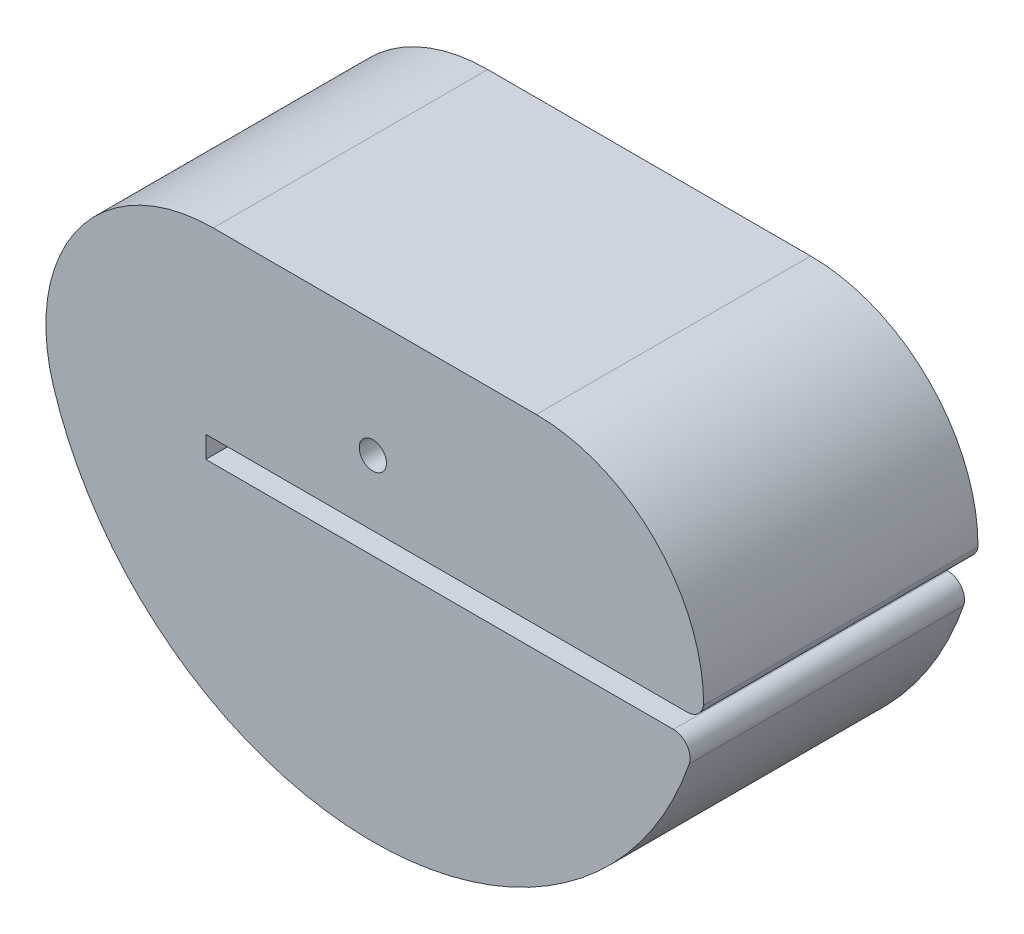
ISO-10303-21;
HEADER;
FILE_DESCRIPTION(('STEP AP214'),'2;1');
FILE_NAME('part.step','',(''),(''),'','','');
FILE_SCHEMA(('AUTOMOTIVE_DESIGN { 1 0 10303 214 1 1 1 1 }'));
ENDSEC;
DATA;
#1=APPLICATION_CONTEXT('core data for automotive mechanical design processes');
#2=APPLICATION_PROTOCOL_DEFINITION('international standard','automotive_design',2000,#1);
#3=PRODUCT_CONTEXT('',#1,'mechanical');
#4=PRODUCT('Part','Part','',(#3));
#5=PRODUCT_RELATED_PRODUCT_CATEGORY('part','',(#4));
#6=PRODUCT_DEFINITION_FORMATION('','',#4);
#7=PRODUCT_DEFINITION_CONTEXT('part definition',#1,'design');
#8=PRODUCT_DEFINITION('design','',#6,#7);
#9=PRODUCT_DEFINITION_SHAPE('','',#8);
#10=(LENGTH_UNIT() NAMED_UNIT(*) SI_UNIT(.MILLI.,.METRE.));
#11=(NAMED_UNIT(*) PLANE_ANGLE_UNIT() SI_UNIT($,.RADIAN.));
#12=(NAMED_UNIT(*) SI_UNIT($,.STERADIAN.) SOLID_ANGLE_UNIT());
#13=UNCERTAINTY_MEASURE_WITH_UNIT(LENGTH_MEASURE(1.E-05),#10,'distance_accuracy_value','');
#14=(GEOMETRIC_REPRESENTATION_CONTEXT(3) GLOBAL_UNCERTAINTY_ASSIGNED_CONTEXT((#13)) GLOBAL_UNIT_ASSIGNED_CONTEXT((#10,
#11,#12)) REPRESENTATION_CONTEXT('',''));
#15=CARTESIAN_POINT('',(0.,0.,0.));
#16=DIRECTION('',(0.,0.,1.));
#17=DIRECTION('',(1.,0.,0.));
#18=AXIS2_PLACEMENT_3D('',#15,#16,#17);
#19=CARTESIAN_POINT('',(0.,0.,41.656));
#20=DIRECTION('',(0.,0.,1.));
#21=DIRECTION('',(1.,0.,0.));
#22=AXIS2_PLACEMENT_3D('',#19,#20,#21);
#23=PLANE('',#22);
#24=CARTESIAN_POINT('',(0.,0.,41.656));
#25=DIRECTION('',(0.,0.,1.));
#26=DIRECTION('',(1.,0.,0.));
#27=AXIS2_PLACEMENT_3D('',#24,#25,#26);
#28=CIRCLE('',#27,2.06375);
#29=CARTESIAN_POINT('',(2.06375,0.,41.656));
#30=VERTEX_POINT('',#29);
#31=EDGE_CURVE('E144',#30,#30,#28,.T.);
#32=ORIENTED_EDGE('',*,*,#31,.F.);
#33=EDGE_LOOP('',(#32));
#34=FACE_BOUND('',#33,.T.);
#35=DIRECTION('',(1.,0.,0.));
#36=VECTOR('',#35,1.);
#37=CARTESIAN_POINT('',(0.,17.78,41.656));
#38=LINE('',#37,#36);
#39=CARTESIAN_POINT('',(-24.2300557159904,17.78,41.656));
#40=VERTEX_POINT('',#39);
#41=CARTESIAN_POINT('',(24.8051362479358,17.78,41.656));
#42=VERTEX_POINT('',#41);
#43=EDGE_CURVE('E124',#40,#42,#38,.T.);
#44=ORIENTED_EDGE('',*,*,#43,.F.);
#45=CARTESIAN_POINT('',(-24.2300557159904,-7.62,41.656));
#46=DIRECTION('',(0.,0.,1.));
#47=DIRECTION('',(1.,0.,0.));
#48=AXIS2_PLACEMENT_3D('',#45,#46,#47);
#49=CIRCLE('',#48,25.4);
#50=CARTESIAN_POINT('',(-48.4601114319808,-15.24,41.656));
#51=VERTEX_POINT('',#50);
#52=EDGE_CURVE('E11',#40,#51,#49,.T.);
#53=ORIENTED_EDGE('',*,*,#52,.T.);
#54=CARTESIAN_POINT('',(0.,0.,41.656));
#55=DIRECTION('',(0.,0.,1.));
#56=DIRECTION('',(1.,0.,0.));
#57=AXIS2_PLACEMENT_3D('',#54,#55,#56);
#58=CIRCLE('',#57,50.8);
#59=CARTESIAN_POINT('',(48.0192493258399,-16.5768421052632,41.656));
#60=VERTEX_POINT('',#59);
#61=EDGE_CURVE('E150',#51,#60,#58,.T.);
#62=ORIENTED_EDGE('',*,*,#61,.T.);
#63=CARTESIAN_POINT('',(45.6182868595479,-15.748,41.656));
#64=DIRECTION('',(0.,0.,1.));
#65=DIRECTION('',(1.,0.,0.));
#66=AXIS2_PLACEMENT_3D('',#63,#64,#65);
#67=CIRCLE('',#66,2.54);
#68=CARTESIAN_POINT('',(45.6182868595479,-13.208,41.656));
#69=VERTEX_POINT('',#68);
#70=EDGE_CURVE('E158',#60,#69,#67,.T.);
#71=ORIENTED_EDGE('',*,*,#70,.T.);
#72=DIRECTION('',(1.,0.,0.));
#73=VECTOR('',#72,1.);
#74=CARTESIAN_POINT('',(0.,-13.208,41.656));
#75=LINE('',#74,#73);
#76=CARTESIAN_POINT('',(-25.3591952939101,-13.208,41.656));
#77=VERTEX_POINT('',#76);
#78=EDGE_CURVE('E137',#77,#69,#75,.T.);
#79=ORIENTED_EDGE('',*,*,#78,.F.);
#80=DIRECTION('',(0.,-1.,0.));
#81=VECTOR('',#80,1.);
#82=CARTESIAN_POINT('',(-25.3591952939101,0.,41.656));
#83=LINE('',#82,#81);
#84=CARTESIAN_POINT('',(-25.3591952939101,-9.906,41.656));
#85=VERTEX_POINT('',#84);
#86=EDGE_CURVE('E141',#85,#77,#83,.T.);
#87=ORIENTED_EDGE('',*,*,#86,.F.);
#88=DIRECTION('',(1.,0.,0.));
#89=VECTOR('',#88,1.);
#90=CARTESIAN_POINT('',(0.,-9.906,41.656));
#91=LINE('',#90,#89);
#92=CARTESIAN_POINT('',(47.6945452226982,-9.906,41.656));
#93=VERTEX_POINT('',#92);
#94=EDGE_CURVE('E121',#85,#93,#91,.T.);
#95=ORIENTED_EDGE('',*,*,#94,.T.);
#96=CARTESIAN_POINT('',(47.6945452226982,-7.366,41.656));
#97=DIRECTION('',(0.,0.,1.));
#98=DIRECTION('',(1.,0.,0.));
#99=AXIS2_PLACEMENT_3D('',#96,#97,#98);
#100=CIRCLE('',#99,2.54);
#101=CARTESIAN_POINT('',(50.2047844449454,-7.75368421052631,41.656));
#102=VERTEX_POINT('',#101);
#103=EDGE_CURVE('E156',#93,#102,#100,.T.);
#104=ORIENTED_EDGE('',*,*,#103,.T.);
#105=CARTESIAN_POINT('',(24.8051362479358,-7.62,41.656));
#106=DIRECTION('',(0.,0.,1.));
#107=DIRECTION('',(1.,0.,0.));
#108=AXIS2_PLACEMENT_3D('',#105,#106,#107);
#109=CIRCLE('',#108,25.4);
#110=EDGE_CURVE('E41',#102,#42,#109,.T.);
#111=ORIENTED_EDGE('',*,*,#110,.T.);
#112=EDGE_LOOP('',(#44,#53,#62,#71,#79,#87,#95,#104,#111));
#113=FACE_BOUND('',#112,.T.);
#114=ADVANCED_FACE('F33',(#34,#113),#23,.T.);
#115=CARTESIAN_POINT('',(0.,0.,0.));
#116=DIRECTION('',(0.,0.,1.));
#117=DIRECTION('',(1.,0.,0.));
#118=AXIS2_PLACEMENT_3D('',#115,#116,#117);
#119=PLANE('',#118);
#120=CARTESIAN_POINT('',(0.,0.,0.));
#121=DIRECTION('',(0.,0.,1.));
#122=DIRECTION('',(1.,0.,0.));
#123=AXIS2_PLACEMENT_3D('',#120,#121,#122);
#124=CIRCLE('',#123,2.06375);
#125=CARTESIAN_POINT('',(2.06375,0.,0.));
#126=VERTEX_POINT('',#125);
#127=EDGE_CURVE('E143',#126,#126,#124,.T.);
#128=ORIENTED_EDGE('',*,*,#127,.T.);
#129=EDGE_LOOP('',(#128));
#130=FACE_BOUND('',#129,.T.);
#131=CARTESIAN_POINT('',(0.,0.,0.));
#132=DIRECTION('',(0.,0.,1.));
#133=DIRECTION('',(1.,0.,0.));
#134=AXIS2_PLACEMENT_3D('',#131,#132,#133);
#135=CIRCLE('',#134,50.8);
#136=CARTESIAN_POINT('',(-48.4601114319808,-15.24,0.));
#137=VERTEX_POINT('',#136);
#138=CARTESIAN_POINT('',(48.0192493258399,-16.5768421052632,0.));
#139=VERTEX_POINT('',#138);
#140=EDGE_CURVE('E147',#137,#139,#135,.T.);
#141=ORIENTED_EDGE('',*,*,#140,.F.);
#142=CARTESIAN_POINT('',(-24.2300557159904,-7.62,0.));
#143=DIRECTION('',(0.,0.,1.));
#144=DIRECTION('',(1.,0.,0.));
#145=AXIS2_PLACEMENT_3D('',#142,#143,#144);
#146=CIRCLE('',#145,25.4);
#147=CARTESIAN_POINT('',(-24.2300557159904,17.78,0.));
#148=VERTEX_POINT('',#147);
#149=EDGE_CURVE('E176',#137,#148,#146,.F.);
#150=ORIENTED_EDGE('',*,*,#149,.T.);
#151=DIRECTION('',(-1.,0.,0.));
#152=VECTOR('',#151,1.);
#153=CARTESIAN_POINT('',(47.5868847477958,17.78,0.));
#154=LINE('',#153,#152);
#155=CARTESIAN_POINT('',(24.8051362479358,17.78,0.));
#156=VERTEX_POINT('',#155);
#157=EDGE_CURVE('E115',#156,#148,#154,.T.);
#158=ORIENTED_EDGE('',*,*,#157,.F.);
#159=CARTESIAN_POINT('',(24.8051362479358,-7.62,0.));
#160=DIRECTION('',(0.,0.,1.));
#161=DIRECTION('',(1.,0.,0.));
#162=AXIS2_PLACEMENT_3D('',#159,#160,#161);
#163=CIRCLE('',#162,25.4);
#164=CARTESIAN_POINT('',(50.2047844449454,-7.75368421052631,0.));
#165=VERTEX_POINT('',#164);
#166=EDGE_CURVE('E174',#156,#165,#163,.F.);
#167=ORIENTED_EDGE('',*,*,#166,.T.);
#168=CARTESIAN_POINT('',(47.6945452226982,-7.366,0.));
#169=DIRECTION('',(0.,0.,1.));
#170=DIRECTION('',(1.,0.,0.));
#171=AXIS2_PLACEMENT_3D('',#168,#169,#170);
#172=CIRCLE('',#171,2.54);
#173=CARTESIAN_POINT('',(47.6945452226982,-9.906,0.));
#174=VERTEX_POINT('',#173);
#175=EDGE_CURVE('E111',#165,#174,#172,.F.);
#176=ORIENTED_EDGE('',*,*,#175,.T.);
#177=DIRECTION('',(-1.,0.,0.));
#178=VECTOR('',#177,1.);
#179=CARTESIAN_POINT('',(49.8248047060899,-9.906,0.));
#180=LINE('',#179,#178);
#181=CARTESIAN_POINT('',(-25.3591952939101,-9.906,0.));
#182=VERTEX_POINT('',#181);
#183=EDGE_CURVE('E103',#174,#182,#180,.T.);
#184=ORIENTED_EDGE('',*,*,#183,.T.);
#185=DIRECTION('',(0.,1.,0.));
#186=VECTOR('',#185,1.);
#187=CARTESIAN_POINT('',(-25.3591952939101,-13.208,0.));
#188=LINE('',#187,#186);
#189=CARTESIAN_POINT('',(-25.3591952939101,-13.208,0.));
#190=VERTEX_POINT('',#189);
#191=EDGE_CURVE('E109',#190,#182,#188,.T.);
#192=ORIENTED_EDGE('',*,*,#191,.F.);
#193=DIRECTION('',(-1.,0.,0.));
#194=VECTOR('',#193,1.);
#195=CARTESIAN_POINT('',(49.8248047060899,-13.208,0.));
#196=LINE('',#195,#194);
#197=CARTESIAN_POINT('',(45.6182868595479,-13.208,0.));
#198=VERTEX_POINT('',#197);
#199=EDGE_CURVE('E130',#198,#190,#196,.T.);
#200=ORIENTED_EDGE('',*,*,#199,.F.);
#201=CARTESIAN_POINT('',(45.6182868595479,-15.748,0.));
#202=DIRECTION('',(0.,0.,1.));
#203=DIRECTION('',(1.,0.,0.));
#204=AXIS2_PLACEMENT_3D('',#201,#202,#203);
#205=CIRCLE('',#204,2.54);
#206=EDGE_CURVE('E163',#198,#139,#205,.F.);
#207=ORIENTED_EDGE('',*,*,#206,.T.);
#208=EDGE_LOOP('',(#141,#150,#158,#167,#176,#184,#192,#200,#207));
#209=FACE_BOUND('',#208,.T.);
#210=ADVANCED_FACE('F106',(#130,#209),#119,.F.);
#211=CARTESIAN_POINT('',(0.,0.,41.656));
#212=DIRECTION('',(0.,0.,-1.));
#213=DIRECTION('',(-1.,0.,0.));
#214=AXIS2_PLACEMENT_3D('',#211,#212,#213);
#215=CYLINDRICAL_SURFACE('',#214,50.8);
#216=ORIENTED_EDGE('',*,*,#61,.F.);
#217=DIRECTION('',(0.,0.,-1.));
#218=VECTOR('',#217,1.);
#219=CARTESIAN_POINT('',(-48.4601114319808,-15.24,41.656));
#220=LINE('',#219,#218);
#221=EDGE_CURVE('E171',#51,#137,#220,.T.);
#222=ORIENTED_EDGE('',*,*,#221,.T.);
#223=ORIENTED_EDGE('',*,*,#140,.T.);
#224=DIRECTION('',(0.,0.,-1.));
#225=VECTOR('',#224,1.);
#226=CARTESIAN_POINT('',(48.0192493258399,-16.5768421052632,41.656));
#227=LINE('',#226,#225);
#228=EDGE_CURVE('E152',#139,#60,#227,.F.);
#229=ORIENTED_EDGE('',*,*,#228,.T.);
#230=EDGE_LOOP('',(#216,#222,#223,#229));
#231=FACE_BOUND('',#230,.T.);
#232=ADVANCED_FACE('F191',(#231),#215,.T.);
#233=CARTESIAN_POINT('',(0.,0.,41.656));
#234=DIRECTION('',(0.,0.,-1.));
#235=DIRECTION('',(-1.,0.,0.));
#236=AXIS2_PLACEMENT_3D('',#233,#234,#235);
#237=CYLINDRICAL_SURFACE('',#236,2.06375);
#238=ORIENTED_EDGE('',*,*,#31,.T.);
#239=EDGE_LOOP('',(#238));
#240=FACE_BOUND('',#239,.T.);
#241=ORIENTED_EDGE('',*,*,#127,.F.);
#242=EDGE_LOOP('',(#241));
#243=FACE_BOUND('',#242,.T.);
#244=ADVANCED_FACE('F218',(#240,#243),#237,.F.);
#245=CARTESIAN_POINT('',(47.5868847477958,17.78,76.2));
#246=DIRECTION('',(0.,-1.,0.));
#247=DIRECTION('',(0.,0.,-1.));
#248=AXIS2_PLACEMENT_3D('',#245,#246,#247);
#249=PLANE('',#248);
#250=ORIENTED_EDGE('',*,*,#157,.T.);
#251=DIRECTION('',(0.,0.,-1.));
#252=VECTOR('',#251,1.);
#253=CARTESIAN_POINT('',(-24.2300557159904,17.78,76.2));
#254=LINE('',#253,#252);
#255=EDGE_CURVE('E54',#148,#40,#254,.F.);
#256=ORIENTED_EDGE('',*,*,#255,.T.);
#257=ORIENTED_EDGE('',*,*,#43,.T.);
#258=DIRECTION('',(0.,0.,-1.));
#259=VECTOR('',#258,1.);
#260=CARTESIAN_POINT('',(24.8051362479358,17.78,76.2));
#261=LINE('',#260,#259);
#262=EDGE_CURVE('E178',#42,#156,#261,.T.);
#263=ORIENTED_EDGE('',*,*,#262,.T.);
#264=EDGE_LOOP('',(#250,#256,#257,#263));
#265=FACE_BOUND('',#264,.T.);
#266=ADVANCED_FACE('F183',(#265),#249,.F.);
#267=CARTESIAN_POINT('',(49.8248047060899,-9.906,76.2));
#268=DIRECTION('',(0.,-1.,0.));
#269=DIRECTION('',(0.,0.,-1.));
#270=AXIS2_PLACEMENT_3D('',#267,#268,#269);
#271=PLANE('',#270);
#272=ORIENTED_EDGE('',*,*,#183,.F.);
#273=DIRECTION('',(0.,0.,1.));
#274=VECTOR('',#273,1.);
#275=CARTESIAN_POINT('',(47.6945452226982,-9.906,41.656));
#276=LINE('',#275,#274);
#277=EDGE_CURVE('E166',#174,#93,#276,.T.);
#278=ORIENTED_EDGE('',*,*,#277,.T.);
#279=ORIENTED_EDGE('',*,*,#94,.F.);
#280=DIRECTION('',(0.,0.,-1.));
#281=VECTOR('',#280,1.);
#282=CARTESIAN_POINT('',(-25.3591952939101,-9.906,76.2));
#283=LINE('',#282,#281);
#284=EDGE_CURVE('E118',#85,#182,#283,.T.);
#285=ORIENTED_EDGE('',*,*,#284,.T.);
#286=EDGE_LOOP('',(#272,#278,#279,#285));
#287=FACE_BOUND('',#286,.T.);
#288=ADVANCED_FACE('F119',(#287),#271,.T.);
#289=CARTESIAN_POINT('',(-25.3591952939101,-13.208,76.2));
#290=DIRECTION('',(-1.,0.,0.));
#291=DIRECTION('',(0.,0.,1.));
#292=AXIS2_PLACEMENT_3D('',#289,#290,#291);
#293=PLANE('',#292);
#294=ORIENTED_EDGE('',*,*,#86,.T.);
#295=DIRECTION('',(0.,0.,-1.));
#296=VECTOR('',#295,1.);
#297=CARTESIAN_POINT('',(-25.3591952939101,-13.208,76.2));
#298=LINE('',#297,#296);
#299=EDGE_CURVE('E125',#77,#190,#298,.T.);
#300=ORIENTED_EDGE('',*,*,#299,.T.);
#301=ORIENTED_EDGE('',*,*,#191,.T.);
#302=ORIENTED_EDGE('',*,*,#284,.F.);
#303=EDGE_LOOP('',(#294,#300,#301,#302));
#304=FACE_BOUND('',#303,.T.);
#305=ADVANCED_FACE('F128',(#304),#293,.F.);
#306=CARTESIAN_POINT('',(49.8248047060899,-13.208,76.2));
#307=DIRECTION('',(0.,-1.,0.));
#308=DIRECTION('',(0.,0.,-1.));
#309=AXIS2_PLACEMENT_3D('',#306,#307,#308);
#310=PLANE('',#309);
#311=ORIENTED_EDGE('',*,*,#78,.T.);
#312=DIRECTION('',(0.,0.,-1.));
#313=VECTOR('',#312,1.);
#314=CARTESIAN_POINT('',(45.6182868595479,-13.208,76.2));
#315=LINE('',#314,#313);
#316=EDGE_CURVE('E160',#69,#198,#315,.T.);
#317=ORIENTED_EDGE('',*,*,#316,.T.);
#318=ORIENTED_EDGE('',*,*,#199,.T.);
#319=ORIENTED_EDGE('',*,*,#299,.F.);
#320=EDGE_LOOP('',(#311,#317,#318,#319));
#321=FACE_BOUND('',#320,.T.);
#322=ADVANCED_FACE('F200',(#321),#310,.F.);
#323=CARTESIAN_POINT('',(45.6182868595479,-15.748,41.656));
#324=DIRECTION('',(0.,0.,-1.));
#325=DIRECTION('',(-1.,0.,0.));
#326=AXIS2_PLACEMENT_3D('',#323,#324,#325);
#327=CYLINDRICAL_SURFACE('',#326,2.54);
#328=ORIENTED_EDGE('',*,*,#206,.F.);
#329=ORIENTED_EDGE('',*,*,#316,.F.);
#330=ORIENTED_EDGE('',*,*,#70,.F.);
#331=ORIENTED_EDGE('',*,*,#228,.F.);
#332=EDGE_LOOP('',(#328,#329,#330,#331));
#333=FACE_BOUND('',#332,.T.);
#334=ADVANCED_FACE('F198',(#333),#327,.T.);
#335=CARTESIAN_POINT('',(47.6945452226982,-7.366,41.656));
#336=DIRECTION('',(0.,0.,-1.));
#337=DIRECTION('',(-1.,0.,0.));
#338=AXIS2_PLACEMENT_3D('',#335,#336,#337);
#339=CYLINDRICAL_SURFACE('',#338,2.54);
#340=ORIENTED_EDGE('',*,*,#175,.F.);
#341=DIRECTION('',(0.,0.,-1.));
#342=VECTOR('',#341,1.);
#343=CARTESIAN_POINT('',(50.2047844449454,-7.75368421052631,41.656));
#344=LINE('',#343,#342);
#345=EDGE_CURVE('E168',#102,#165,#344,.T.);
#346=ORIENTED_EDGE('',*,*,#345,.F.);
#347=ORIENTED_EDGE('',*,*,#103,.F.);
#348=ORIENTED_EDGE('',*,*,#277,.F.);
#349=EDGE_LOOP('',(#340,#346,#347,#348));
#350=FACE_BOUND('',#349,.T.);
#351=ADVANCED_FACE('F203',(#350),#339,.T.);
#352=CARTESIAN_POINT('',(-24.2300557159904,-7.62,41.656));
#353=DIRECTION('',(0.,0.,-1.));
#354=DIRECTION('',(-1.,0.,0.));
#355=AXIS2_PLACEMENT_3D('',#352,#353,#354);
#356=CYLINDRICAL_SURFACE('',#355,25.4);
#357=ORIENTED_EDGE('',*,*,#52,.F.);
#358=ORIENTED_EDGE('',*,*,#255,.F.);
#359=ORIENTED_EDGE('',*,*,#149,.F.);
#360=ORIENTED_EDGE('',*,*,#221,.F.);
#361=EDGE_LOOP('',(#357,#358,#359,#360));
#362=FACE_BOUND('',#361,.T.);
#363=ADVANCED_FACE('F188',(#362),#356,.T.);
#364=CARTESIAN_POINT('',(24.8051362479358,-7.62,41.656));
#365=DIRECTION('',(0.,0.,-1.));
#366=DIRECTION('',(-1.,0.,0.));
#367=AXIS2_PLACEMENT_3D('',#364,#365,#366);
#368=CYLINDRICAL_SURFACE('',#367,25.4);
#369=ORIENTED_EDGE('',*,*,#110,.F.);
#370=ORIENTED_EDGE('',*,*,#345,.T.);
#371=ORIENTED_EDGE('',*,*,#166,.F.);
#372=ORIENTED_EDGE('',*,*,#262,.F.);
#373=EDGE_LOOP('',(#369,#370,#371,#372));
#374=FACE_BOUND('',#373,.T.);
#375=ADVANCED_FACE('F35',(#374),#368,.T.);
#376=CLOSED_SHELL('',(#114,#210,#232,#244,#266,#288,#305,#322,#334,#351,#363,#375));
#377=MANIFOLD_SOLID_BREP('B2',#376);
#378=ADVANCED_BREP_SHAPE_REPRESENTATION('',(#18,#377),#14);
#379=SHAPE_DEFINITION_REPRESENTATION(#9,#378);
ENDSEC;
END-ISO-10303-21;
